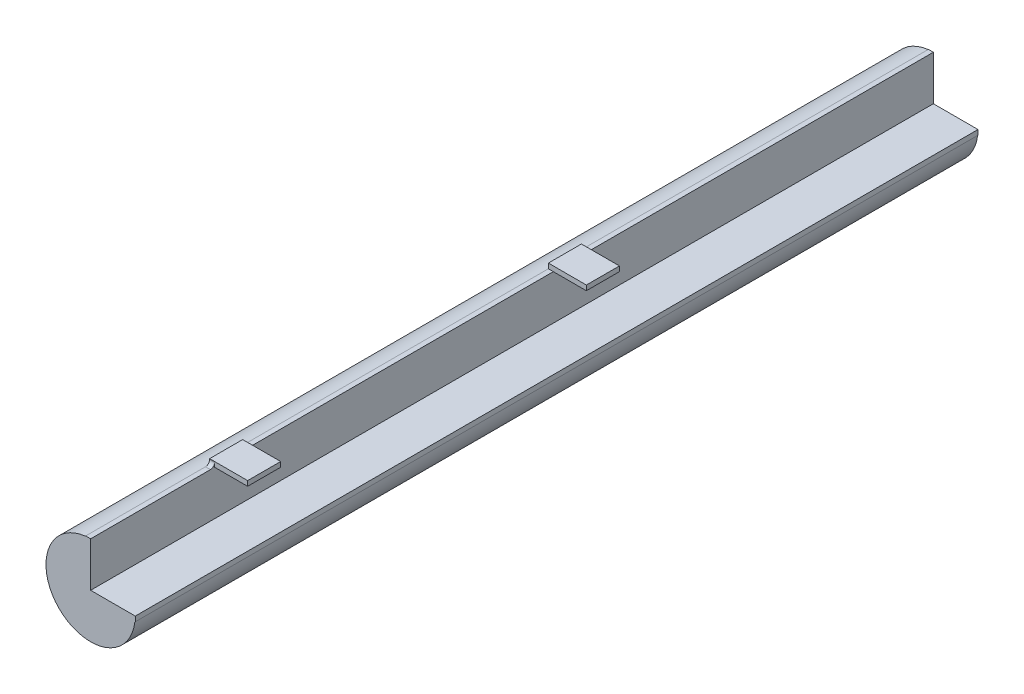
ISO-10303-21;
HEADER;
FILE_DESCRIPTION(('STEP AP214'),'2;1');
FILE_NAME('part.step','',(''),(''),'','','');
FILE_SCHEMA(('AUTOMOTIVE_DESIGN { 1 0 10303 214 1 1 1 1 }'));
ENDSEC;
DATA;
#1=APPLICATION_CONTEXT('core data for automotive mechanical design processes');
#2=APPLICATION_PROTOCOL_DEFINITION('international standard','automotive_design',2000,#1);
#3=PRODUCT_CONTEXT('',#1,'mechanical');
#4=PRODUCT('Part','Part','',(#3));
#5=PRODUCT_RELATED_PRODUCT_CATEGORY('part','',(#4));
#6=PRODUCT_DEFINITION_FORMATION('','',#4);
#7=PRODUCT_DEFINITION_CONTEXT('part definition',#1,'design');
#8=PRODUCT_DEFINITION('design','',#6,#7);
#9=PRODUCT_DEFINITION_SHAPE('','',#8);
#10=(LENGTH_UNIT() NAMED_UNIT(*) SI_UNIT(.MILLI.,.METRE.));
#11=(NAMED_UNIT(*) PLANE_ANGLE_UNIT() SI_UNIT($,.RADIAN.));
#12=(NAMED_UNIT(*) SI_UNIT($,.STERADIAN.) SOLID_ANGLE_UNIT());
#13=UNCERTAINTY_MEASURE_WITH_UNIT(LENGTH_MEASURE(1.E-05),#10,'distance_accuracy_value','');
#14=(GEOMETRIC_REPRESENTATION_CONTEXT(3) GLOBAL_UNCERTAINTY_ASSIGNED_CONTEXT((#13)) GLOBAL_UNIT_ASSIGNED_CONTEXT((#10,
#11,#12)) REPRESENTATION_CONTEXT('',''));
#15=CARTESIAN_POINT('',(0.,0.,0.));
#16=DIRECTION('',(0.,0.,1.));
#17=DIRECTION('',(1.,0.,0.));
#18=AXIS2_PLACEMENT_3D('',#15,#16,#17);
#19=CARTESIAN_POINT('',(-3.,30.,180.));
#20=DIRECTION('',(0.,0.,-1.));
#21=DIRECTION('',(-1.,0.,0.));
#22=AXIS2_PLACEMENT_3D('',#19,#20,#21);
#23=PLANE('',#22);
#24=DIRECTION('',(-1.,0.,0.));
#25=VECTOR('',#24,1.);
#26=CARTESIAN_POINT('',(0.,29.5,180.));
#27=LINE('',#26,#25);
#28=CARTESIAN_POINT('',(0.,29.5,180.));
#29=VERTEX_POINT('',#28);
#30=CARTESIAN_POINT('',(-3.,29.5,180.));
#31=VERTEX_POINT('',#30);
#32=EDGE_CURVE('E667',#29,#31,#27,.T.);
#33=ORIENTED_EDGE('',*,*,#32,.F.);
#34=DIRECTION('',(0.,-1.,0.));
#35=VECTOR('',#34,1.);
#36=CARTESIAN_POINT('',(0.,0.,180.));
#37=LINE('',#36,#35);
#38=CARTESIAN_POINT('',(0.,27.,180.));
#39=VERTEX_POINT('',#38);
#40=EDGE_CURVE('E670',#29,#39,#37,.T.);
#41=ORIENTED_EDGE('',*,*,#40,.T.);
#42=DIRECTION('',(1.,0.,0.));
#43=VECTOR('',#42,1.);
#44=CARTESIAN_POINT('',(-3.,27.,180.));
#45=LINE('',#44,#43);
#46=CARTESIAN_POINT('',(20.,27.,180.));
#47=VERTEX_POINT('',#46);
#48=EDGE_CURVE('E227',#39,#47,#45,.T.);
#49=ORIENTED_EDGE('',*,*,#48,.T.);
#50=DIRECTION('',(0.,-1.,0.));
#51=VECTOR('',#50,1.);
#52=CARTESIAN_POINT('',(20.,30.,180.));
#53=LINE('',#52,#51);
#54=CARTESIAN_POINT('',(20.,30.,180.));
#55=VERTEX_POINT('',#54);
#56=EDGE_CURVE('E256',#55,#47,#53,.T.);
#57=ORIENTED_EDGE('',*,*,#56,.F.);
#58=DIRECTION('',(1.,0.,0.));
#59=VECTOR('',#58,1.);
#60=CARTESIAN_POINT('',(-3.,30.,180.));
#61=LINE('',#60,#59);
#62=CARTESIAN_POINT('',(-3.,30.,180.));
#63=VERTEX_POINT('',#62);
#64=EDGE_CURVE('E232',#63,#55,#61,.T.);
#65=ORIENTED_EDGE('',*,*,#64,.F.);
#66=DIRECTION('',(0.,-1.,0.));
#67=VECTOR('',#66,1.);
#68=CARTESIAN_POINT('',(-3.,30.,180.));
#69=LINE('',#68,#67);
#70=EDGE_CURVE('E260',#63,#31,#69,.T.);
#71=ORIENTED_EDGE('',*,*,#70,.T.);
#72=EDGE_LOOP('',(#33,#41,#49,#57,#65,#71));
#73=FACE_BOUND('',#72,.T.);
#74=ADVANCED_FACE('F45',(#73),#23,.F.);
#75=CARTESIAN_POINT('',(0.,27.,255.));
#76=DIRECTION('',(0.,-1.,0.));
#77=DIRECTION('',(0.,0.,-1.));
#78=AXIS2_PLACEMENT_3D('',#75,#76,#77);
#79=PLANE('',#78);
#80=DIRECTION('',(1.,0.,0.));
#81=VECTOR('',#80,1.);
#82=CARTESIAN_POINT('',(-2.99999999999998,27.,-25.));
#83=LINE('',#82,#81);
#84=CARTESIAN_POINT('',(-2.99999999999998,27.,-25.));
#85=VERTEX_POINT('',#84);
#86=CARTESIAN_POINT('',(0.,27.,-25.));
#87=VERTEX_POINT('',#86);
#88=EDGE_CURVE('E210',#85,#87,#83,.T.);
#89=ORIENTED_EDGE('',*,*,#88,.F.);
#90=DIRECTION('',(0.,0.,-1.));
#91=VECTOR('',#90,1.);
#92=CARTESIAN_POINT('',(-3.,27.,255.));
#93=LINE('',#92,#91);
#94=CARTESIAN_POINT('',(-3.,27.,160.));
#95=VERTEX_POINT('',#94);
#96=EDGE_CURVE('E331',#95,#85,#93,.T.);
#97=ORIENTED_EDGE('',*,*,#96,.F.);
#98=DIRECTION('',(-1.,0.,0.));
#99=VECTOR('',#98,1.);
#100=CARTESIAN_POINT('',(-3.,27.,160.));
#101=LINE('',#100,#99);
#102=CARTESIAN_POINT('',(0.,27.,160.));
#103=VERTEX_POINT('',#102);
#104=EDGE_CURVE('E11',#103,#95,#101,.T.);
#105=ORIENTED_EDGE('',*,*,#104,.F.);
#106=DIRECTION('',(0.,0.,-1.));
#107=VECTOR('',#106,1.);
#108=CARTESIAN_POINT('',(0.,27.,255.));
#109=LINE('',#108,#107);
#110=EDGE_CURVE('E338',#103,#87,#109,.T.);
#111=ORIENTED_EDGE('',*,*,#110,.T.);
#112=EDGE_LOOP('',(#89,#97,#105,#111));
#113=FACE_BOUND('',#112,.T.);
#114=ADVANCED_FACE('F371',(#113),#79,.F.);
#115=DIRECTION('',(-1.,0.,0.));
#116=VECTOR('',#115,1.);
#117=CARTESIAN_POINT('',(-3.,27.,-45.));
#118=LINE('',#117,#116);
#119=CARTESIAN_POINT('',(0.,27.,-45.));
#120=VERTEX_POINT('',#119);
#121=CARTESIAN_POINT('',(-3.,27.,-45.));
#122=VERTEX_POINT('',#121);
#123=EDGE_CURVE('E204',#120,#122,#118,.T.);
#124=ORIENTED_EDGE('',*,*,#123,.F.);
#125=CARTESIAN_POINT('',(0.,27.,-255.));
#126=VERTEX_POINT('',#125);
#127=EDGE_CURVE('E330',#120,#126,#109,.T.);
#128=ORIENTED_EDGE('',*,*,#127,.T.);
#129=DIRECTION('',(-1.,0.,0.));
#130=VECTOR('',#129,1.);
#131=CARTESIAN_POINT('',(0.,27.,-255.));
#132=LINE('',#131,#130);
#133=CARTESIAN_POINT('',(-3.,27.,-255.));
#134=VERTEX_POINT('',#133);
#135=EDGE_CURVE('E291',#126,#134,#132,.T.);
#136=ORIENTED_EDGE('',*,*,#135,.T.);
#137=EDGE_CURVE('E327',#122,#134,#93,.T.);
#138=ORIENTED_EDGE('',*,*,#137,.F.);
#139=EDGE_LOOP('',(#124,#128,#136,#138));
#140=FACE_BOUND('',#139,.T.);
#141=ADVANCED_FACE('F348',(#140),#79,.F.);
#142=CARTESIAN_POINT('',(0.,27.,255.));
#143=VERTEX_POINT('',#142);
#144=CARTESIAN_POINT('',(0.,27.,182.5));
#145=VERTEX_POINT('',#144);
#146=EDGE_CURVE('E49',#143,#145,#109,.T.);
#147=ORIENTED_EDGE('',*,*,#146,.T.);
#148=DIRECTION('',(-1.,0.,0.));
#149=VECTOR('',#148,1.);
#150=CARTESIAN_POINT('',(0.,27.,182.5));
#151=LINE('',#150,#149);
#152=CARTESIAN_POINT('',(-3.,27.,182.5));
#153=VERTEX_POINT('',#152);
#154=EDGE_CURVE('E67',#145,#153,#151,.T.);
#155=ORIENTED_EDGE('',*,*,#154,.T.);
#156=CARTESIAN_POINT('',(-3.,27.,255.));
#157=VERTEX_POINT('',#156);
#158=EDGE_CURVE('E328',#157,#153,#93,.T.);
#159=ORIENTED_EDGE('',*,*,#158,.F.);
#160=DIRECTION('',(-1.,0.,0.));
#161=VECTOR('',#160,1.);
#162=CARTESIAN_POINT('',(0.,27.,255.));
#163=LINE('',#162,#161);
#164=EDGE_CURVE('E268',#143,#157,#163,.T.);
#165=ORIENTED_EDGE('',*,*,#164,.F.);
#166=EDGE_LOOP('',(#147,#155,#159,#165));
#167=FACE_BOUND('',#166,.T.);
#168=ADVANCED_FACE('F369',(#167),#79,.F.);
#169=CARTESIAN_POINT('',(0.,27.,255.));
#170=DIRECTION('',(-1.,0.,0.));
#171=DIRECTION('',(0.,-1.,0.));
#172=AXIS2_PLACEMENT_3D('',#169,#170,#171);
#173=PLANE('',#172);
#174=DIRECTION('',(0.,1.,0.));
#175=VECTOR('',#174,1.);
#176=CARTESIAN_POINT('',(0.,27.,-255.));
#177=LINE('',#176,#175);
#178=CARTESIAN_POINT('',(0.,0.,-255.));
#179=VERTEX_POINT('',#178);
#180=EDGE_CURVE('E263',#179,#126,#177,.T.);
#181=ORIENTED_EDGE('',*,*,#180,.T.);
#182=ORIENTED_EDGE('',*,*,#127,.F.);
#183=DIRECTION('',(0.,0.,-1.));
#184=VECTOR('',#183,1.);
#185=CARTESIAN_POINT('',(0.,27.,255.));
#186=LINE('',#185,#184);
#187=EDGE_CURVE('E202',#87,#120,#186,.T.);
#188=ORIENTED_EDGE('',*,*,#187,.F.);
#189=ORIENTED_EDGE('',*,*,#110,.F.);
#190=EDGE_CURVE('E691',#39,#103,#109,.T.);
#191=ORIENTED_EDGE('',*,*,#190,.F.);
#192=ORIENTED_EDGE('',*,*,#40,.F.);
#193=CARTESIAN_POINT('',(0.,29.5,182.5));
#194=DIRECTION('',(1.,0.,0.));
#195=DIRECTION('',(0.,0.,-1.));
#196=AXIS2_PLACEMENT_3D('',#193,#194,#195);
#197=CIRCLE('',#196,2.5);
#198=EDGE_CURVE('E673',#29,#145,#197,.F.);
#199=ORIENTED_EDGE('',*,*,#198,.T.);
#200=ORIENTED_EDGE('',*,*,#146,.F.);
#201=DIRECTION('',(0.,1.,0.));
#202=VECTOR('',#201,1.);
#203=CARTESIAN_POINT('',(0.,27.,255.));
#204=LINE('',#203,#202);
#205=CARTESIAN_POINT('',(0.,0.,255.));
#206=VERTEX_POINT('',#205);
#207=EDGE_CURVE('E264',#206,#143,#204,.T.);
#208=ORIENTED_EDGE('',*,*,#207,.F.);
#209=DIRECTION('',(0.,0.,-1.));
#210=VECTOR('',#209,1.);
#211=CARTESIAN_POINT('',(0.,0.,255.));
#212=LINE('',#211,#210);
#213=EDGE_CURVE('E287',#206,#179,#212,.T.);
#214=ORIENTED_EDGE('',*,*,#213,.T.);
#215=EDGE_LOOP('',(#181,#182,#188,#189,#191,#192,#199,#200,#208,#214));
#216=FACE_BOUND('',#215,.T.);
#217=ADVANCED_FACE('F47',(#216),#173,.F.);
#218=CARTESIAN_POINT('',(-3.,27.,255.));
#219=DIRECTION('',(1.,0.,0.));
#220=DIRECTION('',(0.,0.,-1.));
#221=AXIS2_PLACEMENT_3D('',#218,#219,#220);
#222=PLANE('',#221);
#223=DIRECTION('',(0.,-1.,0.));
#224=VECTOR('',#223,1.);
#225=CARTESIAN_POINT('',(-3.,27.,-255.));
#226=LINE('',#225,#224);
#227=CARTESIAN_POINT('',(-3.,26.8328157299975,-255.));
#228=VERTEX_POINT('',#227);
#229=EDGE_CURVE('E295',#134,#228,#226,.T.);
#230=ORIENTED_EDGE('',*,*,#229,.T.);
#231=DIRECTION('',(0.,0.,-1.));
#232=VECTOR('',#231,1.);
#233=CARTESIAN_POINT('',(-3.,26.8328157299975,255.));
#234=LINE('',#233,#232);
#235=CARTESIAN_POINT('',(-3.,26.8328157299975,255.));
#236=VERTEX_POINT('',#235);
#237=EDGE_CURVE('E324',#236,#228,#234,.T.);
#238=ORIENTED_EDGE('',*,*,#237,.F.);
#239=DIRECTION('',(0.,-1.,0.));
#240=VECTOR('',#239,1.);
#241=CARTESIAN_POINT('',(-3.,27.,255.));
#242=LINE('',#241,#240);
#243=EDGE_CURVE('E272',#157,#236,#242,.T.);
#244=ORIENTED_EDGE('',*,*,#243,.F.);
#245=ORIENTED_EDGE('',*,*,#158,.T.);
#246=CARTESIAN_POINT('',(-3.,29.5,182.5));
#247=DIRECTION('',(1.,0.,0.));
#248=DIRECTION('',(0.,0.,-1.));
#249=AXIS2_PLACEMENT_3D('',#246,#247,#248);
#250=CIRCLE('',#249,2.5);
#251=EDGE_CURVE('E665',#31,#153,#250,.F.);
#252=ORIENTED_EDGE('',*,*,#251,.F.);
#253=ORIENTED_EDGE('',*,*,#70,.F.);
#254=DIRECTION('',(0.,0.,1.));
#255=VECTOR('',#254,1.);
#256=CARTESIAN_POINT('',(-3.,30.,180.));
#257=LINE('',#256,#255);
#258=CARTESIAN_POINT('',(-3.,30.,160.));
#259=VERTEX_POINT('',#258);
#260=EDGE_CURVE('E228',#259,#63,#257,.T.);
#261=ORIENTED_EDGE('',*,*,#260,.F.);
#262=DIRECTION('',(0.,-1.,0.));
#263=VECTOR('',#262,1.);
#264=CARTESIAN_POINT('',(-3.,30.,160.));
#265=LINE('',#264,#263);
#266=EDGE_CURVE('E241',#259,#95,#265,.T.);
#267=ORIENTED_EDGE('',*,*,#266,.T.);
#268=ORIENTED_EDGE('',*,*,#96,.T.);
#269=DIRECTION('',(0.,-1.,0.));
#270=VECTOR('',#269,1.);
#271=CARTESIAN_POINT('',(-2.99999999999998,30.,-25.));
#272=LINE('',#271,#270);
#273=CARTESIAN_POINT('',(-2.99999999999998,30.,-25.));
#274=VERTEX_POINT('',#273);
#275=EDGE_CURVE('E681',#274,#85,#272,.T.);
#276=ORIENTED_EDGE('',*,*,#275,.F.);
#277=DIRECTION('',(0.,0.,1.));
#278=VECTOR('',#277,1.);
#279=CARTESIAN_POINT('',(-3.,30.,-45.));
#280=LINE('',#279,#278);
#281=CARTESIAN_POINT('',(-3.,30.,-45.));
#282=VERTEX_POINT('',#281);
#283=EDGE_CURVE('E207',#282,#274,#280,.T.);
#284=ORIENTED_EDGE('',*,*,#283,.F.);
#285=DIRECTION('',(0.,-1.,0.));
#286=VECTOR('',#285,1.);
#287=CARTESIAN_POINT('',(-3.,30.,-45.));
#288=LINE('',#287,#286);
#289=EDGE_CURVE('E198',#282,#122,#288,.T.);
#290=ORIENTED_EDGE('',*,*,#289,.T.);
#291=ORIENTED_EDGE('',*,*,#137,.T.);
#292=EDGE_LOOP('',(#230,#238,#244,#245,#252,#253,#261,#267,#268,#276,#284,#290,#291));
#293=FACE_BOUND('',#292,.T.);
#294=ADVANCED_FACE('F342',(#293),#222,.F.);
#295=CARTESIAN_POINT('',(-0.0331449920469178,-0.00368499870751979,255.));
#296=DIRECTION('',(0.,0.,-1.));
#297=DIRECTION('',(-1.,0.,0.));
#298=AXIS2_PLACEMENT_3D('',#295,#296,#297);
#299=CYLINDRICAL_SURFACE('',#298,27.);
#300=CARTESIAN_POINT('',(-0.0331449920469178,-0.00368499870751979,-255.));
#301=DIRECTION('',(0.,0.,1.));
#302=DIRECTION('',(1.,0.,0.));
#303=AXIS2_PLACEMENT_3D('',#300,#301,#302);
#304=CIRCLE('',#303,27.);
#305=CARTESIAN_POINT('',(26.8000824771382,-3.,-255.));
#306=VERTEX_POINT('',#305);
#307=EDGE_CURVE('E298',#228,#306,#304,.T.);
#308=ORIENTED_EDGE('',*,*,#307,.T.);
#309=DIRECTION('',(0.,0.,-1.));
#310=VECTOR('',#309,1.);
#311=CARTESIAN_POINT('',(26.8000824771382,-3.,255.));
#312=LINE('',#311,#310);
#313=CARTESIAN_POINT('',(26.8000824771382,-3.,255.));
#314=VERTEX_POINT('',#313);
#315=EDGE_CURVE('E320',#314,#306,#312,.T.);
#316=ORIENTED_EDGE('',*,*,#315,.F.);
#317=CARTESIAN_POINT('',(-0.0331449920469178,-0.00368499870751979,255.));
#318=DIRECTION('',(0.,0.,1.));
#319=DIRECTION('',(1.,0.,0.));
#320=AXIS2_PLACEMENT_3D('',#317,#318,#319);
#321=CIRCLE('',#320,27.);
#322=EDGE_CURVE('E275',#236,#314,#321,.T.);
#323=ORIENTED_EDGE('',*,*,#322,.F.);
#324=ORIENTED_EDGE('',*,*,#237,.T.);
#325=EDGE_LOOP('',(#308,#316,#323,#324));
#326=FACE_BOUND('',#325,.T.);
#327=ADVANCED_FACE('F358',(#326),#299,.T.);
#328=CARTESIAN_POINT('',(27.,-3.,255.));
#329=DIRECTION('',(0.,1.,0.));
#330=DIRECTION('',(0.,0.,1.));
#331=AXIS2_PLACEMENT_3D('',#328,#329,#330);
#332=PLANE('',#331);
#333=DIRECTION('',(1.,0.,0.));
#334=VECTOR('',#333,1.);
#335=CARTESIAN_POINT('',(27.,-3.,-255.));
#336=LINE('',#335,#334);
#337=CARTESIAN_POINT('',(27.,-3.,-255.));
#338=VERTEX_POINT('',#337);
#339=EDGE_CURVE('E301',#306,#338,#336,.T.);
#340=ORIENTED_EDGE('',*,*,#339,.T.);
#341=DIRECTION('',(0.,0.,-1.));
#342=VECTOR('',#341,1.);
#343=CARTESIAN_POINT('',(27.,-3.,255.));
#344=LINE('',#343,#342);
#345=CARTESIAN_POINT('',(27.,-3.,255.));
#346=VERTEX_POINT('',#345);
#347=EDGE_CURVE('E316',#346,#338,#344,.T.);
#348=ORIENTED_EDGE('',*,*,#347,.F.);
#349=DIRECTION('',(1.,0.,0.));
#350=VECTOR('',#349,1.);
#351=CARTESIAN_POINT('',(27.,-3.,255.));
#352=LINE('',#351,#350);
#353=EDGE_CURVE('E278',#314,#346,#352,.T.);
#354=ORIENTED_EDGE('',*,*,#353,.F.);
#355=ORIENTED_EDGE('',*,*,#315,.T.);
#356=EDGE_LOOP('',(#340,#348,#354,#355));
#357=FACE_BOUND('',#356,.T.);
#358=ADVANCED_FACE('F362',(#357),#332,.F.);
#359=CARTESIAN_POINT('',(27.,0.,255.));
#360=DIRECTION('',(-1.,0.,0.));
#361=DIRECTION('',(0.,0.,1.));
#362=AXIS2_PLACEMENT_3D('',#359,#360,#361);
#363=PLANE('',#362);
#364=DIRECTION('',(0.,1.,0.));
#365=VECTOR('',#364,1.);
#366=CARTESIAN_POINT('',(27.,0.,-255.));
#367=LINE('',#366,#365);
#368=CARTESIAN_POINT('',(27.,0.,-255.));
#369=VERTEX_POINT('',#368);
#370=EDGE_CURVE('E304',#338,#369,#367,.T.);
#371=ORIENTED_EDGE('',*,*,#370,.T.);
#372=DIRECTION('',(0.,0.,-1.));
#373=VECTOR('',#372,1.);
#374=CARTESIAN_POINT('',(27.,0.,255.));
#375=LINE('',#374,#373);
#376=CARTESIAN_POINT('',(27.,0.,255.));
#377=VERTEX_POINT('',#376);
#378=EDGE_CURVE('E312',#377,#369,#375,.T.);
#379=ORIENTED_EDGE('',*,*,#378,.F.);
#380=DIRECTION('',(0.,1.,0.));
#381=VECTOR('',#380,1.);
#382=CARTESIAN_POINT('',(27.,0.,255.));
#383=LINE('',#382,#381);
#384=EDGE_CURVE('E281',#346,#377,#383,.T.);
#385=ORIENTED_EDGE('',*,*,#384,.F.);
#386=ORIENTED_EDGE('',*,*,#347,.T.);
#387=EDGE_LOOP('',(#371,#379,#385,#386));
#388=FACE_BOUND('',#387,.T.);
#389=ADVANCED_FACE('F396',(#388),#363,.F.);
#390=CARTESIAN_POINT('',(0.,0.,255.));
#391=DIRECTION('',(0.,-1.,0.));
#392=DIRECTION('',(0.,0.,-1.));
#393=AXIS2_PLACEMENT_3D('',#390,#391,#392);
#394=PLANE('',#393);
#395=DIRECTION('',(-1.,0.,0.));
#396=VECTOR('',#395,1.);
#397=CARTESIAN_POINT('',(0.,0.,-255.));
#398=LINE('',#397,#396);
#399=EDGE_CURVE('E269',#369,#179,#398,.T.);
#400=ORIENTED_EDGE('',*,*,#399,.T.);
#401=ORIENTED_EDGE('',*,*,#213,.F.);
#402=DIRECTION('',(-1.,0.,0.));
#403=VECTOR('',#402,1.);
#404=CARTESIAN_POINT('',(0.,0.,255.));
#405=LINE('',#404,#403);
#406=EDGE_CURVE('E284',#377,#206,#405,.T.);
#407=ORIENTED_EDGE('',*,*,#406,.F.);
#408=ORIENTED_EDGE('',*,*,#378,.T.);
#409=EDGE_LOOP('',(#400,#401,#407,#408));
#410=FACE_BOUND('',#409,.T.);
#411=ADVANCED_FACE('F391',(#410),#394,.F.);
#412=CARTESIAN_POINT('',(-0.0331449920469178,-0.00368499870751979,255.));
#413=DIRECTION('',(0.,0.,1.));
#414=DIRECTION('',(1.,0.,0.));
#415=AXIS2_PLACEMENT_3D('',#412,#413,#414);
#416=PLANE('',#415);
#417=ORIENTED_EDGE('',*,*,#207,.T.);
#418=ORIENTED_EDGE('',*,*,#164,.T.);
#419=ORIENTED_EDGE('',*,*,#243,.T.);
#420=ORIENTED_EDGE('',*,*,#322,.T.);
#421=ORIENTED_EDGE('',*,*,#353,.T.);
#422=ORIENTED_EDGE('',*,*,#384,.T.);
#423=ORIENTED_EDGE('',*,*,#406,.T.);
#424=EDGE_LOOP('',(#417,#418,#419,#420,#421,#422,#423));
#425=FACE_BOUND('',#424,.T.);
#426=ADVANCED_FACE('F366',(#425),#416,.T.);
#427=CARTESIAN_POINT('',(-0.0331449920469178,-0.00368499870751979,-255.));
#428=DIRECTION('',(0.,0.,1.));
#429=DIRECTION('',(1.,0.,0.));
#430=AXIS2_PLACEMENT_3D('',#427,#428,#429);
#431=PLANE('',#430);
#432=ORIENTED_EDGE('',*,*,#180,.F.);
#433=ORIENTED_EDGE('',*,*,#399,.F.);
#434=ORIENTED_EDGE('',*,*,#370,.F.);
#435=ORIENTED_EDGE('',*,*,#339,.F.);
#436=ORIENTED_EDGE('',*,*,#307,.F.);
#437=ORIENTED_EDGE('',*,*,#229,.F.);
#438=ORIENTED_EDGE('',*,*,#135,.F.);
#439=EDGE_LOOP('',(#432,#433,#434,#435,#436,#437,#438));
#440=FACE_BOUND('',#439,.T.);
#441=ADVANCED_FACE('F353',(#440),#431,.F.);
#442=CARTESIAN_POINT('',(20.,30.,180.));
#443=DIRECTION('',(-1.,0.,0.));
#444=DIRECTION('',(0.,0.,1.));
#445=AXIS2_PLACEMENT_3D('',#442,#443,#444);
#446=PLANE('',#445);
#447=DIRECTION('',(0.,0.,-1.));
#448=VECTOR('',#447,1.);
#449=CARTESIAN_POINT('',(20.,27.,180.));
#450=LINE('',#449,#448);
#451=CARTESIAN_POINT('',(20.,27.,160.));
#452=VERTEX_POINT('',#451);
#453=EDGE_CURVE('E244',#47,#452,#450,.T.);
#454=ORIENTED_EDGE('',*,*,#453,.T.);
#455=DIRECTION('',(0.,-1.,0.));
#456=VECTOR('',#455,1.);
#457=CARTESIAN_POINT('',(20.,30.,160.));
#458=LINE('',#457,#456);
#459=CARTESIAN_POINT('',(20.,30.,160.));
#460=VERTEX_POINT('',#459);
#461=EDGE_CURVE('E252',#460,#452,#458,.T.);
#462=ORIENTED_EDGE('',*,*,#461,.F.);
#463=DIRECTION('',(0.,0.,-1.));
#464=VECTOR('',#463,1.);
#465=CARTESIAN_POINT('',(20.,30.,180.));
#466=LINE('',#465,#464);
#467=EDGE_CURVE('E235',#55,#460,#466,.T.);
#468=ORIENTED_EDGE('',*,*,#467,.F.);
#469=ORIENTED_EDGE('',*,*,#56,.T.);
#470=EDGE_LOOP('',(#454,#462,#468,#469));
#471=FACE_BOUND('',#470,.T.);
#472=ADVANCED_FACE('F387',(#471),#446,.F.);
#473=CARTESIAN_POINT('',(-3.,30.,160.));
#474=DIRECTION('',(0.,0.,1.));
#475=DIRECTION('',(1.,0.,0.));
#476=AXIS2_PLACEMENT_3D('',#473,#474,#475);
#477=PLANE('',#476);
#478=EDGE_CURVE('E56',#452,#103,#101,.T.);
#479=ORIENTED_EDGE('',*,*,#478,.T.);
#480=ORIENTED_EDGE('',*,*,#104,.T.);
#481=ORIENTED_EDGE('',*,*,#266,.F.);
#482=DIRECTION('',(-1.,0.,0.));
#483=VECTOR('',#482,1.);
#484=CARTESIAN_POINT('',(-3.,30.,160.));
#485=LINE('',#484,#483);
#486=EDGE_CURVE('E238',#460,#259,#485,.T.);
#487=ORIENTED_EDGE('',*,*,#486,.F.);
#488=ORIENTED_EDGE('',*,*,#461,.T.);
#489=EDGE_LOOP('',(#479,#480,#481,#487,#488));
#490=FACE_BOUND('',#489,.T.);
#491=ADVANCED_FACE('F439',(#490),#477,.F.);
#492=CARTESIAN_POINT('',(0.,30.,0.));
#493=DIRECTION('',(0.,-1.,0.));
#494=DIRECTION('',(0.,0.,-1.));
#495=AXIS2_PLACEMENT_3D('',#492,#493,#494);
#496=PLANE('',#495);
#497=ORIENTED_EDGE('',*,*,#260,.T.);
#498=ORIENTED_EDGE('',*,*,#64,.T.);
#499=ORIENTED_EDGE('',*,*,#467,.T.);
#500=ORIENTED_EDGE('',*,*,#486,.T.);
#501=EDGE_LOOP('',(#497,#498,#499,#500));
#502=FACE_BOUND('',#501,.T.);
#503=ADVANCED_FACE('F446',(#502),#496,.F.);
#504=CARTESIAN_POINT('',(0.,27.,0.));
#505=DIRECTION('',(0.,-1.,0.));
#506=DIRECTION('',(0.,0.,-1.));
#507=AXIS2_PLACEMENT_3D('',#504,#505,#506);
#508=PLANE('',#507);
#509=ORIENTED_EDGE('',*,*,#48,.F.);
#510=ORIENTED_EDGE('',*,*,#190,.T.);
#511=ORIENTED_EDGE('',*,*,#478,.F.);
#512=ORIENTED_EDGE('',*,*,#453,.F.);
#513=EDGE_LOOP('',(#509,#510,#511,#512));
#514=FACE_BOUND('',#513,.T.);
#515=ADVANCED_FACE('F453',(#514),#508,.T.);
#516=CARTESIAN_POINT('',(0.,27.,0.));
#517=DIRECTION('',(0.,1.,0.));
#518=DIRECTION('',(0.,0.,1.));
#519=AXIS2_PLACEMENT_3D('',#516,#517,#518);
#520=PLANE('',#519);
#521=CARTESIAN_POINT('',(20.,27.,-25.));
#522=VERTEX_POINT('',#521);
#523=EDGE_CURVE('E187',#87,#522,#83,.T.);
#524=ORIENTED_EDGE('',*,*,#523,.F.);
#525=ORIENTED_EDGE('',*,*,#187,.T.);
#526=CARTESIAN_POINT('',(20.,27.,-45.));
#527=VERTEX_POINT('',#526);
#528=EDGE_CURVE('E188',#527,#120,#118,.T.);
#529=ORIENTED_EDGE('',*,*,#528,.F.);
#530=DIRECTION('',(0.,0.,-1.));
#531=VECTOR('',#530,1.);
#532=CARTESIAN_POINT('',(20.,27.,-45.));
#533=LINE('',#532,#531);
#534=EDGE_CURVE('E176',#522,#527,#533,.T.);
#535=ORIENTED_EDGE('',*,*,#534,.F.);
#536=EDGE_LOOP('',(#524,#525,#529,#535));
#537=FACE_BOUND('',#536,.T.);
#538=ADVANCED_FACE('F200',(#537),#520,.F.);
#539=CARTESIAN_POINT('',(-2.99999999999998,30.,-25.));
#540=DIRECTION('',(0.,0.,-1.));
#541=DIRECTION('',(-1.,0.,0.));
#542=AXIS2_PLACEMENT_3D('',#539,#540,#541);
#543=PLANE('',#542);
#544=ORIENTED_EDGE('',*,*,#88,.T.);
#545=ORIENTED_EDGE('',*,*,#523,.T.);
#546=DIRECTION('',(0.,-1.,0.));
#547=VECTOR('',#546,1.);
#548=CARTESIAN_POINT('',(20.,30.,-25.));
#549=LINE('',#548,#547);
#550=CARTESIAN_POINT('',(20.,30.,-25.));
#551=VERTEX_POINT('',#550);
#552=EDGE_CURVE('E183',#551,#522,#549,.T.);
#553=ORIENTED_EDGE('',*,*,#552,.F.);
#554=DIRECTION('',(1.,0.,0.));
#555=VECTOR('',#554,1.);
#556=CARTESIAN_POINT('',(-2.99999999999998,30.,-25.));
#557=LINE('',#556,#555);
#558=EDGE_CURVE('E219',#274,#551,#557,.T.);
#559=ORIENTED_EDGE('',*,*,#558,.F.);
#560=ORIENTED_EDGE('',*,*,#275,.T.);
#561=EDGE_LOOP('',(#544,#545,#553,#559,#560));
#562=FACE_BOUND('',#561,.T.);
#563=ADVANCED_FACE('F468',(#562),#543,.F.);
#564=CARTESIAN_POINT('',(20.,30.,-45.));
#565=DIRECTION('',(-1.,0.,0.));
#566=DIRECTION('',(0.,0.,1.));
#567=AXIS2_PLACEMENT_3D('',#564,#565,#566);
#568=PLANE('',#567);
#569=ORIENTED_EDGE('',*,*,#534,.T.);
#570=DIRECTION('',(0.,-1.,0.));
#571=VECTOR('',#570,1.);
#572=CARTESIAN_POINT('',(20.,30.,-45.));
#573=LINE('',#572,#571);
#574=CARTESIAN_POINT('',(20.,30.,-45.));
#575=VERTEX_POINT('',#574);
#576=EDGE_CURVE('E180',#575,#527,#573,.T.);
#577=ORIENTED_EDGE('',*,*,#576,.F.);
#578=DIRECTION('',(0.,0.,-1.));
#579=VECTOR('',#578,1.);
#580=CARTESIAN_POINT('',(20.,30.,-45.));
#581=LINE('',#580,#579);
#582=EDGE_CURVE('E216',#551,#575,#581,.T.);
#583=ORIENTED_EDGE('',*,*,#582,.F.);
#584=ORIENTED_EDGE('',*,*,#552,.T.);
#585=EDGE_LOOP('',(#569,#577,#583,#584));
#586=FACE_BOUND('',#585,.T.);
#587=ADVANCED_FACE('F178',(#586),#568,.F.);
#588=CARTESIAN_POINT('',(-3.,30.,-45.));
#589=DIRECTION('',(0.,0.,1.));
#590=DIRECTION('',(1.,0.,0.));
#591=AXIS2_PLACEMENT_3D('',#588,#589,#590);
#592=PLANE('',#591);
#593=ORIENTED_EDGE('',*,*,#528,.T.);
#594=ORIENTED_EDGE('',*,*,#123,.T.);
#595=ORIENTED_EDGE('',*,*,#289,.F.);
#596=DIRECTION('',(-1.,0.,0.));
#597=VECTOR('',#596,1.);
#598=CARTESIAN_POINT('',(-3.,30.,-45.));
#599=LINE('',#598,#597);
#600=EDGE_CURVE('E196',#575,#282,#599,.T.);
#601=ORIENTED_EDGE('',*,*,#600,.F.);
#602=ORIENTED_EDGE('',*,*,#576,.T.);
#603=EDGE_LOOP('',(#593,#594,#595,#601,#602));
#604=FACE_BOUND('',#603,.T.);
#605=ADVANCED_FACE('F192',(#604),#592,.F.);
#606=CARTESIAN_POINT('',(0.,30.,0.));
#607=DIRECTION('',(0.,1.,0.));
#608=DIRECTION('',(0.,0.,1.));
#609=AXIS2_PLACEMENT_3D('',#606,#607,#608);
#610=PLANE('',#609);
#611=ORIENTED_EDGE('',*,*,#283,.T.);
#612=ORIENTED_EDGE('',*,*,#558,.T.);
#613=ORIENTED_EDGE('',*,*,#582,.T.);
#614=ORIENTED_EDGE('',*,*,#600,.T.);
#615=EDGE_LOOP('',(#611,#612,#613,#614));
#616=FACE_BOUND('',#615,.T.);
#617=ADVANCED_FACE('F488',(#616),#610,.T.);
#618=CARTESIAN_POINT('',(0.,29.5,182.5));
#619=DIRECTION('',(-1.,0.,0.));
#620=DIRECTION('',(0.,0.,1.));
#621=AXIS2_PLACEMENT_3D('',#618,#619,#620);
#622=CYLINDRICAL_SURFACE('',#621,2.5);
#623=ORIENTED_EDGE('',*,*,#251,.T.);
#624=ORIENTED_EDGE('',*,*,#154,.F.);
#625=ORIENTED_EDGE('',*,*,#198,.F.);
#626=ORIENTED_EDGE('',*,*,#32,.T.);
#627=EDGE_LOOP('',(#623,#624,#625,#626));
#628=FACE_BOUND('',#627,.T.);
#629=ADVANCED_FACE('F495',(#628),#622,.F.);
#630=CLOSED_SHELL('',(#74,#114,#141,#168,#217,#294,#327,#358,#389,#411,#426,#441,#472,#491,#503,
#515,#538,#563,#587,#605,#617,#629));
#631=MANIFOLD_SOLID_BREP('B2',#630);
#632=ADVANCED_BREP_SHAPE_REPRESENTATION('',(#18,#631),#14);
#633=SHAPE_DEFINITION_REPRESENTATION(#9,#632);
ENDSEC;
END-ISO-10303-21;
